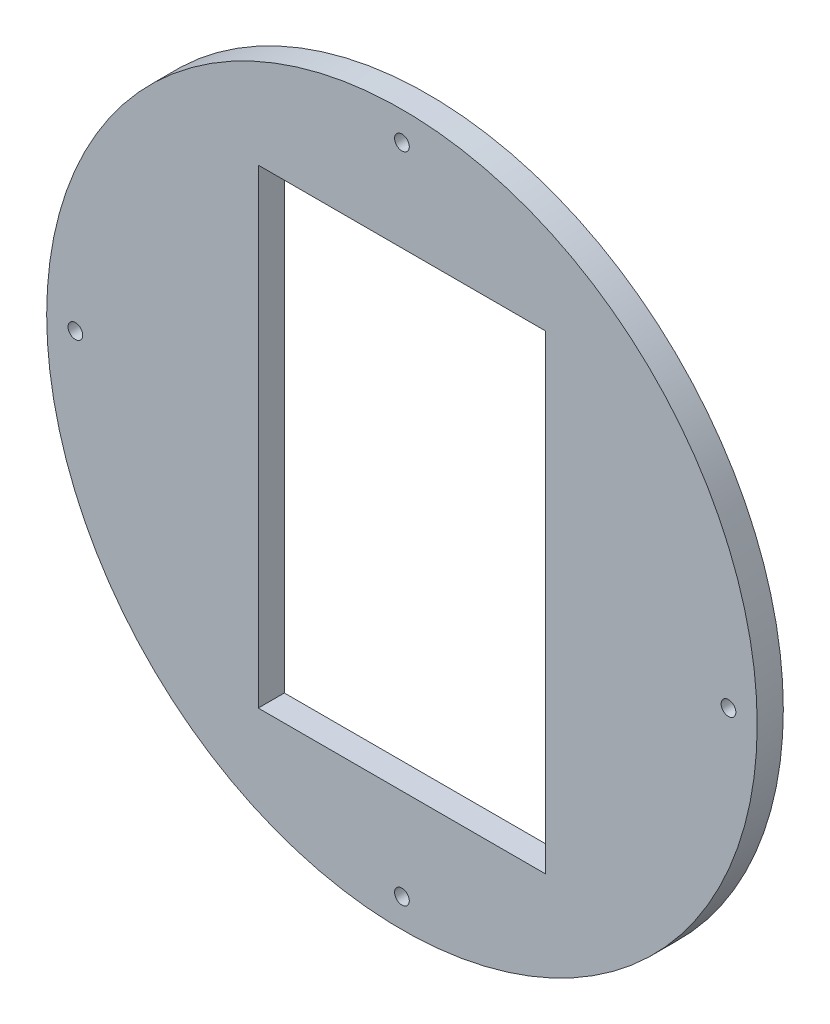
ISO-10303-21;
HEADER;
FILE_DESCRIPTION(('STEP AP214'),'2;1');
FILE_NAME('part.step','',(''),(''),'','','');
FILE_SCHEMA(('AUTOMOTIVE_DESIGN { 1 0 10303 214 1 1 1 1 }'));
ENDSEC;
DATA;
#1=APPLICATION_CONTEXT('core data for automotive mechanical design processes');
#2=APPLICATION_PROTOCOL_DEFINITION('international standard','automotive_design',2000,#1);
#3=PRODUCT_CONTEXT('',#1,'mechanical');
#4=PRODUCT('Part','Part','',(#3));
#5=PRODUCT_RELATED_PRODUCT_CATEGORY('part','',(#4));
#6=PRODUCT_DEFINITION_FORMATION('','',#4);
#7=PRODUCT_DEFINITION_CONTEXT('part definition',#1,'design');
#8=PRODUCT_DEFINITION('design','',#6,#7);
#9=PRODUCT_DEFINITION_SHAPE('','',#8);
#10=(LENGTH_UNIT() NAMED_UNIT(*) SI_UNIT(.MILLI.,.METRE.));
#11=(NAMED_UNIT(*) PLANE_ANGLE_UNIT() SI_UNIT($,.RADIAN.));
#12=(NAMED_UNIT(*) SI_UNIT($,.STERADIAN.) SOLID_ANGLE_UNIT());
#13=UNCERTAINTY_MEASURE_WITH_UNIT(LENGTH_MEASURE(1.E-05),#10,'distance_accuracy_value','');
#14=(GEOMETRIC_REPRESENTATION_CONTEXT(3) GLOBAL_UNCERTAINTY_ASSIGNED_CONTEXT((#13)) GLOBAL_UNIT_ASSIGNED_CONTEXT((#10,
#11,#12)) REPRESENTATION_CONTEXT('',''));
#15=CARTESIAN_POINT('',(0.,0.,0.));
#16=DIRECTION('',(0.,0.,1.));
#17=DIRECTION('',(1.,0.,0.));
#18=AXIS2_PLACEMENT_3D('',#15,#16,#17);
#19=CARTESIAN_POINT('',(0.,0.,6.35));
#20=DIRECTION('',(0.,0.,1.));
#21=DIRECTION('',(1.,0.,0.));
#22=AXIS2_PLACEMENT_3D('',#19,#20,#21);
#23=PLANE('',#22);
#24=DIRECTION('',(0.,-1.,0.));
#25=VECTOR('',#24,1.);
#26=CARTESIAN_POINT('',(34.925,57.15,6.35));
#27=LINE('',#26,#25);
#28=CARTESIAN_POINT('',(34.925,57.15,6.35));
#29=VERTEX_POINT('',#28);
#30=CARTESIAN_POINT('',(34.925,-57.15,6.35));
#31=VERTEX_POINT('',#30);
#32=EDGE_CURVE('E103',#29,#31,#27,.T.);
#33=ORIENTED_EDGE('',*,*,#32,.T.);
#34=DIRECTION('',(-1.,0.,0.));
#35=VECTOR('',#34,1.);
#36=CARTESIAN_POINT('',(-34.925,-57.15,6.35));
#37=LINE('',#36,#35);
#38=CARTESIAN_POINT('',(-34.925,-57.15,6.35));
#39=VERTEX_POINT('',#38);
#40=EDGE_CURVE('E112',#31,#39,#37,.T.);
#41=ORIENTED_EDGE('',*,*,#40,.T.);
#42=DIRECTION('',(0.,1.,0.));
#43=VECTOR('',#42,1.);
#44=CARTESIAN_POINT('',(-34.925,57.15,6.35));
#45=LINE('',#44,#43);
#46=CARTESIAN_POINT('',(-34.925,57.15,6.35));
#47=VERTEX_POINT('',#46);
#48=EDGE_CURVE('E75',#39,#47,#45,.T.);
#49=ORIENTED_EDGE('',*,*,#48,.T.);
#50=DIRECTION('',(1.,0.,0.));
#51=VECTOR('',#50,1.);
#52=CARTESIAN_POINT('',(-34.925,57.15,6.35));
#53=LINE('',#52,#51);
#54=EDGE_CURVE('E109',#47,#29,#53,.T.);
#55=ORIENTED_EDGE('',*,*,#54,.T.);
#56=EDGE_LOOP('',(#33,#41,#49,#55));
#57=FACE_BOUND('',#56,.T.);
#58=CARTESIAN_POINT('',(0.,-79.375,6.35));
#59=DIRECTION('',(0.,0.,1.));
#60=DIRECTION('',(1.,0.,0.));
#61=AXIS2_PLACEMENT_3D('',#58,#59,#60);
#62=CIRCLE('',#61,1.78593750000052);
#63=CARTESIAN_POINT('',(1.78593750000051,-79.375,6.35));
#64=VERTEX_POINT('',#63);
#65=EDGE_CURVE('E143',#64,#64,#62,.T.);
#66=ORIENTED_EDGE('',*,*,#65,.F.);
#67=EDGE_LOOP('',(#66));
#68=FACE_BOUND('',#67,.T.);
#69=CARTESIAN_POINT('',(0.,79.375,6.35));
#70=DIRECTION('',(0.,0.,1.));
#71=DIRECTION('',(1.,0.,0.));
#72=AXIS2_PLACEMENT_3D('',#69,#70,#71);
#73=CIRCLE('',#72,1.7859375);
#74=CARTESIAN_POINT('',(1.7859375,79.375,6.35));
#75=VERTEX_POINT('',#74);
#76=EDGE_CURVE('E155',#75,#75,#73,.T.);
#77=ORIENTED_EDGE('',*,*,#76,.F.);
#78=EDGE_LOOP('',(#77));
#79=FACE_BOUND('',#78,.T.);
#80=CARTESIAN_POINT('',(0.,0.,6.35));
#81=DIRECTION('',(0.,0.,1.));
#82=DIRECTION('',(1.,0.,0.));
#83=AXIS2_PLACEMENT_3D('',#80,#81,#82);
#84=CIRCLE('',#83,86.36);
#85=CARTESIAN_POINT('',(86.36,0.,6.35));
#86=VERTEX_POINT('',#85);
#87=EDGE_CURVE('E12',#86,#86,#84,.T.);
#88=ORIENTED_EDGE('',*,*,#87,.T.);
#89=EDGE_LOOP('',(#88));
#90=FACE_BOUND('',#89,.T.);
#91=CARTESIAN_POINT('',(79.375,0.,6.35));
#92=DIRECTION('',(0.,0.,1.));
#93=DIRECTION('',(1.,0.,0.));
#94=AXIS2_PLACEMENT_3D('',#91,#92,#93);
#95=CIRCLE('',#94,1.78593750000026);
#96=CARTESIAN_POINT('',(81.1609375000003,0.,6.35));
#97=VERTEX_POINT('',#96);
#98=EDGE_CURVE('E149',#97,#97,#95,.T.);
#99=ORIENTED_EDGE('',*,*,#98,.F.);
#100=EDGE_LOOP('',(#99));
#101=FACE_BOUND('',#100,.T.);
#102=CARTESIAN_POINT('',(-79.375,0.,6.35));
#103=DIRECTION('',(0.,0.,1.));
#104=DIRECTION('',(1.,0.,0.));
#105=AXIS2_PLACEMENT_3D('',#102,#103,#104);
#106=CIRCLE('',#105,1.7859375000008);
#107=CARTESIAN_POINT('',(-77.5890624999992,0.,6.35));
#108=VERTEX_POINT('',#107);
#109=EDGE_CURVE('E137',#108,#108,#106,.T.);
#110=ORIENTED_EDGE('',*,*,#109,.F.);
#111=EDGE_LOOP('',(#110));
#112=FACE_BOUND('',#111,.T.);
#113=ADVANCED_FACE('F60',(#57,#68,#79,#90,#101,#112),#23,.T.);
#114=CARTESIAN_POINT('',(0.,0.,0.));
#115=DIRECTION('',(0.,0.,1.));
#116=DIRECTION('',(1.,0.,0.));
#117=AXIS2_PLACEMENT_3D('',#114,#115,#116);
#118=PLANE('',#117);
#119=DIRECTION('',(-1.,0.,0.));
#120=VECTOR('',#119,1.);
#121=CARTESIAN_POINT('',(-34.925,-57.15,0.));
#122=LINE('',#121,#120);
#123=CARTESIAN_POINT('',(34.925,-57.15,0.));
#124=VERTEX_POINT('',#123);
#125=CARTESIAN_POINT('',(-34.925,-57.15,0.));
#126=VERTEX_POINT('',#125);
#127=EDGE_CURVE('E127',#124,#126,#122,.T.);
#128=ORIENTED_EDGE('',*,*,#127,.F.);
#129=DIRECTION('',(0.,-1.,0.));
#130=VECTOR('',#129,1.);
#131=CARTESIAN_POINT('',(34.925,57.15,0.));
#132=LINE('',#131,#130);
#133=CARTESIAN_POINT('',(34.925,57.15,0.));
#134=VERTEX_POINT('',#133);
#135=EDGE_CURVE('E83',#134,#124,#132,.T.);
#136=ORIENTED_EDGE('',*,*,#135,.F.);
#137=DIRECTION('',(1.,0.,0.));
#138=VECTOR('',#137,1.);
#139=CARTESIAN_POINT('',(-34.925,57.15,0.));
#140=LINE('',#139,#138);
#141=CARTESIAN_POINT('',(-34.925,57.15,0.));
#142=VERTEX_POINT('',#141);
#143=EDGE_CURVE('E118',#142,#134,#140,.T.);
#144=ORIENTED_EDGE('',*,*,#143,.F.);
#145=DIRECTION('',(0.,1.,0.));
#146=VECTOR('',#145,1.);
#147=CARTESIAN_POINT('',(-34.925,57.15,0.));
#148=LINE('',#147,#146);
#149=EDGE_CURVE('E121',#126,#142,#148,.T.);
#150=ORIENTED_EDGE('',*,*,#149,.F.);
#151=EDGE_LOOP('',(#128,#136,#144,#150));
#152=FACE_BOUND('',#151,.T.);
#153=CARTESIAN_POINT('',(0.,0.,0.));
#154=DIRECTION('',(0.,0.,1.));
#155=DIRECTION('',(1.,0.,0.));
#156=AXIS2_PLACEMENT_3D('',#153,#154,#155);
#157=CIRCLE('',#156,86.36);
#158=CARTESIAN_POINT('',(86.36,0.,0.));
#159=VERTEX_POINT('',#158);
#160=EDGE_CURVE('E64',#159,#159,#157,.T.);
#161=ORIENTED_EDGE('',*,*,#160,.F.);
#162=EDGE_LOOP('',(#161));
#163=FACE_BOUND('',#162,.T.);
#164=CARTESIAN_POINT('',(0.,79.375,0.));
#165=DIRECTION('',(0.,0.,1.));
#166=DIRECTION('',(1.,0.,0.));
#167=AXIS2_PLACEMENT_3D('',#164,#165,#166);
#168=CIRCLE('',#167,1.7859375);
#169=CARTESIAN_POINT('',(1.7859375,79.375,0.));
#170=VERTEX_POINT('',#169);
#171=EDGE_CURVE('E152',#170,#170,#168,.T.);
#172=ORIENTED_EDGE('',*,*,#171,.T.);
#173=EDGE_LOOP('',(#172));
#174=FACE_BOUND('',#173,.T.);
#175=CARTESIAN_POINT('',(79.375,0.,0.));
#176=DIRECTION('',(0.,0.,1.));
#177=DIRECTION('',(1.,0.,0.));
#178=AXIS2_PLACEMENT_3D('',#175,#176,#177);
#179=CIRCLE('',#178,1.78593750000026);
#180=CARTESIAN_POINT('',(81.1609375000003,0.,0.));
#181=VERTEX_POINT('',#180);
#182=EDGE_CURVE('E146',#181,#181,#179,.T.);
#183=ORIENTED_EDGE('',*,*,#182,.T.);
#184=EDGE_LOOP('',(#183));
#185=FACE_BOUND('',#184,.T.);
#186=CARTESIAN_POINT('',(0.,-79.375,0.));
#187=DIRECTION('',(0.,0.,1.));
#188=DIRECTION('',(1.,0.,0.));
#189=AXIS2_PLACEMENT_3D('',#186,#187,#188);
#190=CIRCLE('',#189,1.78593750000052);
#191=CARTESIAN_POINT('',(1.78593750000051,-79.375,0.));
#192=VERTEX_POINT('',#191);
#193=EDGE_CURVE('E140',#192,#192,#190,.T.);
#194=ORIENTED_EDGE('',*,*,#193,.T.);
#195=EDGE_LOOP('',(#194));
#196=FACE_BOUND('',#195,.T.);
#197=CARTESIAN_POINT('',(-79.375,0.,0.));
#198=DIRECTION('',(0.,0.,1.));
#199=DIRECTION('',(1.,0.,0.));
#200=AXIS2_PLACEMENT_3D('',#197,#198,#199);
#201=CIRCLE('',#200,1.7859375000008);
#202=CARTESIAN_POINT('',(-77.5890624999992,0.,0.));
#203=VERTEX_POINT('',#202);
#204=EDGE_CURVE('E133',#203,#203,#201,.T.);
#205=ORIENTED_EDGE('',*,*,#204,.T.);
#206=EDGE_LOOP('',(#205));
#207=FACE_BOUND('',#206,.T.);
#208=ADVANCED_FACE('F161',(#152,#163,#174,#185,#196,#207),#118,.F.);
#209=CARTESIAN_POINT('',(0.,0.,6.35));
#210=DIRECTION('',(0.,0.,-1.));
#211=DIRECTION('',(-1.,0.,0.));
#212=AXIS2_PLACEMENT_3D('',#209,#210,#211);
#213=CYLINDRICAL_SURFACE('',#212,86.36);
#214=ORIENTED_EDGE('',*,*,#87,.F.);
#215=EDGE_LOOP('',(#214));
#216=FACE_BOUND('',#215,.T.);
#217=ORIENTED_EDGE('',*,*,#160,.T.);
#218=EDGE_LOOP('',(#217));
#219=FACE_BOUND('',#218,.T.);
#220=ADVANCED_FACE('F62',(#216,#219),#213,.T.);
#221=CARTESIAN_POINT('',(0.,79.375,6.35));
#222=DIRECTION('',(0.,0.,-1.));
#223=DIRECTION('',(-1.,0.,0.));
#224=AXIS2_PLACEMENT_3D('',#221,#222,#223);
#225=CYLINDRICAL_SURFACE('',#224,1.7859375);
#226=ORIENTED_EDGE('',*,*,#76,.T.);
#227=EDGE_LOOP('',(#226));
#228=FACE_BOUND('',#227,.T.);
#229=ORIENTED_EDGE('',*,*,#171,.F.);
#230=EDGE_LOOP('',(#229));
#231=FACE_BOUND('',#230,.T.);
#232=ADVANCED_FACE('F164',(#228,#231),#225,.F.);
#233=CARTESIAN_POINT('',(79.375,0.,6.35));
#234=DIRECTION('',(0.,0.,-1.));
#235=DIRECTION('',(-1.,0.,0.));
#236=AXIS2_PLACEMENT_3D('',#233,#234,#235);
#237=CYLINDRICAL_SURFACE('',#236,1.78593750000026);
#238=ORIENTED_EDGE('',*,*,#98,.T.);
#239=EDGE_LOOP('',(#238));
#240=FACE_BOUND('',#239,.T.);
#241=ORIENTED_EDGE('',*,*,#182,.F.);
#242=EDGE_LOOP('',(#241));
#243=FACE_BOUND('',#242,.T.);
#244=ADVANCED_FACE('F166',(#240,#243),#237,.F.);
#245=CARTESIAN_POINT('',(0.,-79.375,6.35));
#246=DIRECTION('',(0.,0.,-1.));
#247=DIRECTION('',(-1.,0.,0.));
#248=AXIS2_PLACEMENT_3D('',#245,#246,#247);
#249=CYLINDRICAL_SURFACE('',#248,1.78593750000052);
#250=ORIENTED_EDGE('',*,*,#65,.T.);
#251=EDGE_LOOP('',(#250));
#252=FACE_BOUND('',#251,.T.);
#253=ORIENTED_EDGE('',*,*,#193,.F.);
#254=EDGE_LOOP('',(#253));
#255=FACE_BOUND('',#254,.T.);
#256=ADVANCED_FACE('F173',(#252,#255),#249,.F.);
#257=CARTESIAN_POINT('',(-79.375,0.,6.35));
#258=DIRECTION('',(0.,0.,-1.));
#259=DIRECTION('',(-1.,0.,0.));
#260=AXIS2_PLACEMENT_3D('',#257,#258,#259);
#261=CYLINDRICAL_SURFACE('',#260,1.7859375000008);
#262=ORIENTED_EDGE('',*,*,#109,.T.);
#263=EDGE_LOOP('',(#262));
#264=FACE_BOUND('',#263,.T.);
#265=ORIENTED_EDGE('',*,*,#204,.F.);
#266=EDGE_LOOP('',(#265));
#267=FACE_BOUND('',#266,.T.);
#268=ADVANCED_FACE('F201',(#264,#267),#261,.F.);
#269=CARTESIAN_POINT('',(34.925,57.15,6.35));
#270=DIRECTION('',(1.,0.,0.));
#271=DIRECTION('',(0.,1.,0.));
#272=AXIS2_PLACEMENT_3D('',#269,#270,#271);
#273=PLANE('',#272);
#274=ORIENTED_EDGE('',*,*,#135,.T.);
#275=DIRECTION('',(0.,0.,-1.));
#276=VECTOR('',#275,1.);
#277=CARTESIAN_POINT('',(34.925,-57.15,6.35));
#278=LINE('',#277,#276);
#279=EDGE_CURVE('E99',#31,#124,#278,.T.);
#280=ORIENTED_EDGE('',*,*,#279,.F.);
#281=ORIENTED_EDGE('',*,*,#32,.F.);
#282=DIRECTION('',(0.,0.,-1.));
#283=VECTOR('',#282,1.);
#284=CARTESIAN_POINT('',(34.925,57.15,6.35));
#285=LINE('',#284,#283);
#286=EDGE_CURVE('E131',#29,#134,#285,.T.);
#287=ORIENTED_EDGE('',*,*,#286,.T.);
#288=EDGE_LOOP('',(#274,#280,#281,#287));
#289=FACE_BOUND('',#288,.T.);
#290=ADVANCED_FACE('F101',(#289),#273,.F.);
#291=CARTESIAN_POINT('',(-34.925,57.15,6.35));
#292=DIRECTION('',(0.,1.,0.));
#293=DIRECTION('',(0.,0.,1.));
#294=AXIS2_PLACEMENT_3D('',#291,#292,#293);
#295=PLANE('',#294);
#296=ORIENTED_EDGE('',*,*,#143,.T.);
#297=ORIENTED_EDGE('',*,*,#286,.F.);
#298=ORIENTED_EDGE('',*,*,#54,.F.);
#299=DIRECTION('',(0.,0.,-1.));
#300=VECTOR('',#299,1.);
#301=CARTESIAN_POINT('',(-34.925,57.15,6.35));
#302=LINE('',#301,#300);
#303=EDGE_CURVE('E134',#47,#142,#302,.T.);
#304=ORIENTED_EDGE('',*,*,#303,.T.);
#305=EDGE_LOOP('',(#296,#297,#298,#304));
#306=FACE_BOUND('',#305,.T.);
#307=ADVANCED_FACE('F193',(#306),#295,.F.);
#308=CARTESIAN_POINT('',(-34.925,57.15,6.35));
#309=DIRECTION('',(-1.,0.,0.));
#310=DIRECTION('',(0.,-1.,0.));
#311=AXIS2_PLACEMENT_3D('',#308,#309,#310);
#312=PLANE('',#311);
#313=ORIENTED_EDGE('',*,*,#149,.T.);
#314=ORIENTED_EDGE('',*,*,#303,.F.);
#315=ORIENTED_EDGE('',*,*,#48,.F.);
#316=DIRECTION('',(0.,0.,-1.));
#317=VECTOR('',#316,1.);
#318=CARTESIAN_POINT('',(-34.925,-57.15,6.35));
#319=LINE('',#318,#317);
#320=EDGE_CURVE('E108',#39,#126,#319,.T.);
#321=ORIENTED_EDGE('',*,*,#320,.T.);
#322=EDGE_LOOP('',(#313,#314,#315,#321));
#323=FACE_BOUND('',#322,.T.);
#324=ADVANCED_FACE('F191',(#323),#312,.F.);
#325=CARTESIAN_POINT('',(-34.925,-57.15,6.35));
#326=DIRECTION('',(0.,-1.,0.));
#327=DIRECTION('',(0.,0.,-1.));
#328=AXIS2_PLACEMENT_3D('',#325,#326,#327);
#329=PLANE('',#328);
#330=ORIENTED_EDGE('',*,*,#127,.T.);
#331=ORIENTED_EDGE('',*,*,#320,.F.);
#332=ORIENTED_EDGE('',*,*,#40,.F.);
#333=ORIENTED_EDGE('',*,*,#279,.T.);
#334=EDGE_LOOP('',(#330,#331,#332,#333));
#335=FACE_BOUND('',#334,.T.);
#336=ADVANCED_FACE('F113',(#335),#329,.F.);
#337=CLOSED_SHELL('',(#113,#208,#220,#232,#244,#256,#268,#290,#307,#324,#336));
#338=MANIFOLD_SOLID_BREP('B2',#337);
#339=ADVANCED_BREP_SHAPE_REPRESENTATION('',(#18,#338),#14);
#340=SHAPE_DEFINITION_REPRESENTATION(#9,#339);
ENDSEC;
END-ISO-10303-21;
